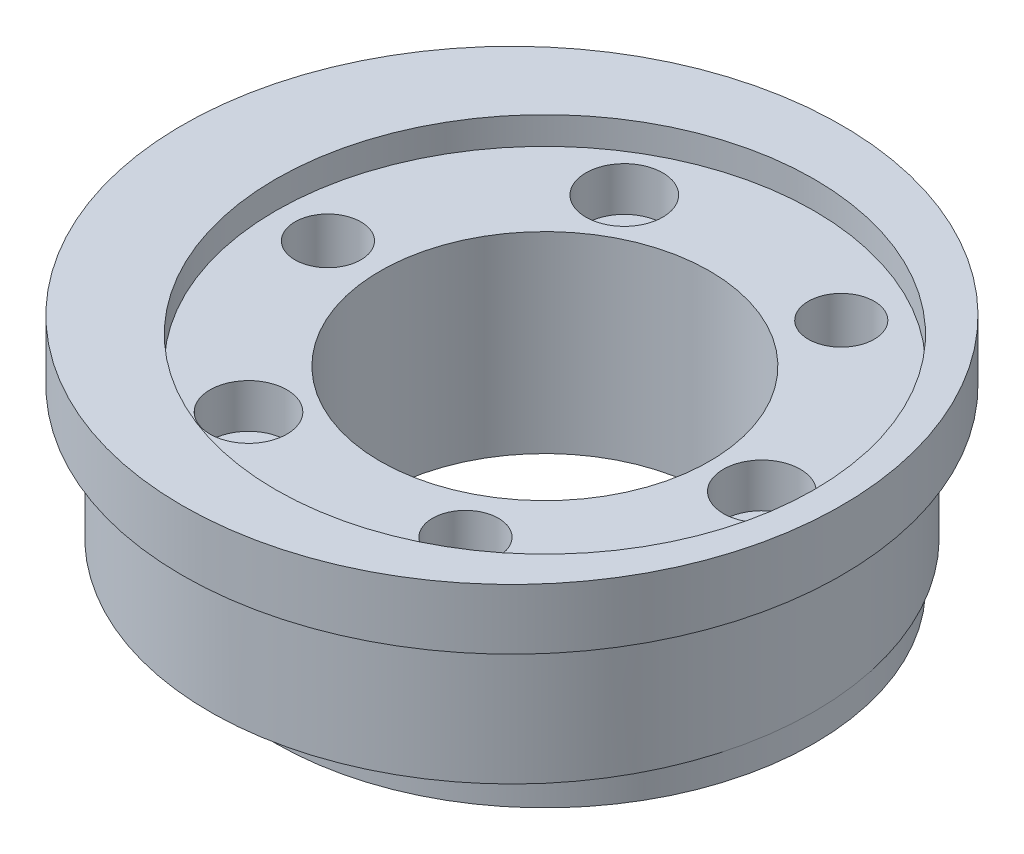
ISO-10303-21;
HEADER;
FILE_DESCRIPTION(('STEP AP214'),'2;1');
FILE_NAME('part.step','',(''),(''),'','','');
FILE_SCHEMA(('AUTOMOTIVE_DESIGN { 1 0 10303 214 1 1 1 1 }'));
ENDSEC;
DATA;
#1=APPLICATION_CONTEXT('core data for automotive mechanical design processes');
#2=APPLICATION_PROTOCOL_DEFINITION('international standard','automotive_design',2000,#1);
#3=PRODUCT_CONTEXT('',#1,'mechanical');
#4=PRODUCT('Part','Part','',(#3));
#5=PRODUCT_RELATED_PRODUCT_CATEGORY('part','',(#4));
#6=PRODUCT_DEFINITION_FORMATION('','',#4);
#7=PRODUCT_DEFINITION_CONTEXT('part definition',#1,'design');
#8=PRODUCT_DEFINITION('design','',#6,#7);
#9=PRODUCT_DEFINITION_SHAPE('','',#8);
#10=(LENGTH_UNIT() NAMED_UNIT(*) SI_UNIT(.MILLI.,.METRE.));
#11=(NAMED_UNIT(*) PLANE_ANGLE_UNIT() SI_UNIT($,.RADIAN.));
#12=(NAMED_UNIT(*) SI_UNIT($,.STERADIAN.) SOLID_ANGLE_UNIT());
#13=UNCERTAINTY_MEASURE_WITH_UNIT(LENGTH_MEASURE(1.E-05),#10,'distance_accuracy_value','');
#14=(GEOMETRIC_REPRESENTATION_CONTEXT(3) GLOBAL_UNCERTAINTY_ASSIGNED_CONTEXT((#13)) GLOBAL_UNIT_ASSIGNED_CONTEXT((#10,
#11,#12)) REPRESENTATION_CONTEXT('',''));
#15=CARTESIAN_POINT('',(0.,0.,0.));
#16=DIRECTION('',(0.,0.,1.));
#17=DIRECTION('',(1.,0.,0.));
#18=AXIS2_PLACEMENT_3D('',#15,#16,#17);
#19=CARTESIAN_POINT('',(0.,15.,0.));
#20=DIRECTION('',(0.,1.,0.));
#21=DIRECTION('',(0.,0.,1.));
#22=AXIS2_PLACEMENT_3D('',#19,#20,#21);
#23=PLANE('',#22);
#24=CARTESIAN_POINT('',(-6.87499999999996,15.,-17.1040017247427));
#25=DIRECTION('',(0.,1.,0.));
#26=DIRECTION('',(0.,0.,1.));
#27=AXIS2_PLACEMENT_3D('',#24,#25,#26);
#28=CIRCLE('',#27,3.5);
#29=CARTESIAN_POINT('',(-6.87499999999996,15.,-13.6040017247427));
#30=VERTEX_POINT('',#29);
#31=EDGE_CURVE('E138',#30,#30,#28,.T.);
#32=ORIENTED_EDGE('',*,*,#31,.F.);
#33=EDGE_LOOP('',(#32));
#34=FACE_BOUND('',#33,.T.);
#35=CARTESIAN_POINT('',(22.7500000000005,15.,-6.83481049534862E-13));
#36=DIRECTION('',(0.,1.,0.));
#37=DIRECTION('',(0.,0.,1.));
#38=AXIS2_PLACEMENT_3D('',#35,#36,#37);
#39=CIRCLE('',#38,3.5);
#40=CARTESIAN_POINT('',(22.7500000000005,15.,3.49999999999932));
#41=VERTEX_POINT('',#40);
#42=EDGE_CURVE('E128',#41,#41,#39,.T.);
#43=ORIENTED_EDGE('',*,*,#42,.F.);
#44=EDGE_LOOP('',(#43));
#45=FACE_BOUND('',#44,.T.);
#46=CARTESIAN_POINT('',(-6.87499999999923,15.,17.1040017247426));
#47=DIRECTION('',(0.,1.,0.));
#48=DIRECTION('',(0.,0.,1.));
#49=AXIS2_PLACEMENT_3D('',#46,#47,#48);
#50=CIRCLE('',#49,3.5);
#51=CARTESIAN_POINT('',(-6.87499999999923,15.,20.6040017247426));
#52=VERTEX_POINT('',#51);
#53=EDGE_CURVE('E118',#52,#52,#50,.T.);
#54=ORIENTED_EDGE('',*,*,#53,.F.);
#55=EDGE_LOOP('',(#54));
#56=FACE_BOUND('',#55,.T.);
#57=CARTESIAN_POINT('',(3.,15.,0.));
#58=DIRECTION('',(0.,1.,0.));
#59=DIRECTION('',(0.,0.,1.));
#60=AXIS2_PLACEMENT_3D('',#57,#58,#59);
#61=CIRCLE('',#60,15.);
#62=CARTESIAN_POINT('',(3.,15.,15.));
#63=VERTEX_POINT('',#62);
#64=EDGE_CURVE('E77',#63,#63,#61,.T.);
#65=ORIENTED_EDGE('',*,*,#64,.F.);
#66=EDGE_LOOP('',(#65));
#67=FACE_BOUND('',#66,.T.);
#68=CARTESIAN_POINT('',(-16.75,15.,0.));
#69=DIRECTION('',(0.,1.,0.));
#70=DIRECTION('',(0.,0.,1.));
#71=AXIS2_PLACEMENT_3D('',#68,#69,#70);
#72=CIRCLE('',#71,3.);
#73=CARTESIAN_POINT('',(-16.75,15.,3.));
#74=VERTEX_POINT('',#73);
#75=EDGE_CURVE('E88',#74,#74,#72,.T.);
#76=ORIENTED_EDGE('',*,*,#75,.F.);
#77=EDGE_LOOP('',(#76));
#78=FACE_BOUND('',#77,.T.);
#79=CARTESIAN_POINT('',(12.8750000000001,15.,-17.1040017247429));
#80=DIRECTION('',(0.,1.,0.));
#81=DIRECTION('',(0.,0.,1.));
#82=AXIS2_PLACEMENT_3D('',#79,#80,#81);
#83=CIRCLE('',#82,3.);
#84=CARTESIAN_POINT('',(12.8750000000001,15.,-14.1040017247429));
#85=VERTEX_POINT('',#84);
#86=EDGE_CURVE('E80',#85,#85,#83,.T.);
#87=ORIENTED_EDGE('',*,*,#86,.F.);
#88=EDGE_LOOP('',(#87));
#89=FACE_BOUND('',#88,.T.);
#90=CARTESIAN_POINT('',(12.8749999999998,15.,17.1040017247425));
#91=DIRECTION('',(0.,1.,0.));
#92=DIRECTION('',(0.,0.,1.));
#93=AXIS2_PLACEMENT_3D('',#90,#91,#92);
#94=CIRCLE('',#93,3.);
#95=CARTESIAN_POINT('',(12.8749999999998,15.,20.1040017247425));
#96=VERTEX_POINT('',#95);
#97=EDGE_CURVE('E73',#96,#96,#94,.T.);
#98=ORIENTED_EDGE('',*,*,#97,.F.);
#99=EDGE_LOOP('',(#98));
#100=FACE_BOUND('',#99,.T.);
#101=CARTESIAN_POINT('',(3.,15.,0.));
#102=DIRECTION('',(0.,1.,0.));
#103=DIRECTION('',(0.,0.,1.));
#104=AXIS2_PLACEMENT_3D('',#101,#102,#103);
#105=CIRCLE('',#104,24.5);
#106=CARTESIAN_POINT('',(3.,15.,24.5));
#107=VERTEX_POINT('',#106);
#108=EDGE_CURVE('E66',#107,#107,#105,.T.);
#109=ORIENTED_EDGE('',*,*,#108,.T.);
#110=EDGE_LOOP('',(#109));
#111=FACE_BOUND('',#110,.T.);
#112=ADVANCED_FACE('F43',(#34,#45,#56,#67,#78,#89,#100,#111),#23,.T.);
#113=CARTESIAN_POINT('',(0.,15.,0.));
#114=DIRECTION('',(0.,-1.,0.));
#115=DIRECTION('',(0.,0.,-1.));
#116=AXIS2_PLACEMENT_3D('',#113,#114,#115);
#117=CYLINDRICAL_SURFACE('',#116,27.5);
#118=CARTESIAN_POINT('',(0.,0.,0.));
#119=DIRECTION('',(0.,1.,0.));
#120=DIRECTION('',(0.,0.,1.));
#121=AXIS2_PLACEMENT_3D('',#118,#119,#120);
#122=CIRCLE('',#121,27.5);
#123=CARTESIAN_POINT('',(27.5,0.,0.));
#124=VERTEX_POINT('',#123);
#125=EDGE_CURVE('E51',#124,#124,#122,.T.);
#126=ORIENTED_EDGE('',*,*,#125,.T.);
#127=EDGE_LOOP('',(#126));
#128=FACE_BOUND('',#127,.T.);
#129=CARTESIAN_POINT('',(0.,12.,0.));
#130=DIRECTION('',(0.,1.,0.));
#131=DIRECTION('',(0.,0.,1.));
#132=AXIS2_PLACEMENT_3D('',#129,#130,#131);
#133=CIRCLE('',#132,27.5);
#134=CARTESIAN_POINT('',(0.,12.,27.5));
#135=VERTEX_POINT('',#134);
#136=EDGE_CURVE('E11',#135,#135,#133,.T.);
#137=ORIENTED_EDGE('',*,*,#136,.F.);
#138=EDGE_LOOP('',(#137));
#139=FACE_BOUND('',#138,.T.);
#140=ADVANCED_FACE('F45',(#128,#139),#117,.T.);
#141=CARTESIAN_POINT('',(22.75,-2.5,1.39413705213259E-13));
#142=DIRECTION('',(0.,1.,0.));
#143=DIRECTION('',(0.,0.,1.));
#144=AXIS2_PLACEMENT_3D('',#141,#142,#143);
#145=CYLINDRICAL_SURFACE('',#144,2.);
#146=CARTESIAN_POINT('',(22.75,-2.5,1.39413705213259E-13));
#147=DIRECTION('',(0.,1.,0.));
#148=DIRECTION('',(0.,0.,1.));
#149=AXIS2_PLACEMENT_3D('',#146,#147,#148);
#150=CIRCLE('',#149,2.);
#151=CARTESIAN_POINT('',(22.75,-2.5,2.00000000000014));
#152=VERTEX_POINT('',#151);
#153=EDGE_CURVE('E108',#152,#152,#150,.T.);
#154=ORIENTED_EDGE('',*,*,#153,.F.);
#155=EDGE_LOOP('',(#154));
#156=FACE_BOUND('',#155,.T.);
#157=CARTESIAN_POINT('',(22.75,11.,1.39413705213259E-13));
#158=DIRECTION('',(0.,1.,0.));
#159=DIRECTION('',(0.,0.,1.));
#160=AXIS2_PLACEMENT_3D('',#157,#158,#159);
#161=CIRCLE('',#160,2.);
#162=CARTESIAN_POINT('',(22.75,11.,2.00000000000014));
#163=VERTEX_POINT('',#162);
#164=EDGE_CURVE('E134',#163,#163,#161,.F.);
#165=ORIENTED_EDGE('',*,*,#164,.F.);
#166=EDGE_LOOP('',(#165));
#167=FACE_BOUND('',#166,.T.);
#168=ADVANCED_FACE('F198',(#156,#167),#145,.F.);
#169=CARTESIAN_POINT('',(-6.8750000000002,-2.5,17.1040017247425));
#170=DIRECTION('',(0.,1.,0.));
#171=DIRECTION('',(0.,0.,1.));
#172=AXIS2_PLACEMENT_3D('',#169,#170,#171);
#173=CYLINDRICAL_SURFACE('',#172,2.);
#174=CARTESIAN_POINT('',(-6.8750000000002,-2.5,17.1040017247425));
#175=DIRECTION('',(0.,1.,0.));
#176=DIRECTION('',(0.,0.,1.));
#177=AXIS2_PLACEMENT_3D('',#174,#175,#176);
#178=CIRCLE('',#177,2.);
#179=CARTESIAN_POINT('',(-6.8750000000002,-2.5,19.1040017247425));
#180=VERTEX_POINT('',#179);
#181=EDGE_CURVE('E111',#180,#180,#178,.T.);
#182=ORIENTED_EDGE('',*,*,#181,.F.);
#183=EDGE_LOOP('',(#182));
#184=FACE_BOUND('',#183,.T.);
#185=CARTESIAN_POINT('',(-6.8750000000002,11.,17.1040017247425));
#186=DIRECTION('',(0.,1.,0.));
#187=DIRECTION('',(0.,0.,1.));
#188=AXIS2_PLACEMENT_3D('',#185,#186,#187);
#189=CIRCLE('',#188,2.);
#190=CARTESIAN_POINT('',(-6.8750000000002,11.,19.1040017247425));
#191=VERTEX_POINT('',#190);
#192=EDGE_CURVE('E122',#191,#191,#189,.F.);
#193=ORIENTED_EDGE('',*,*,#192,.F.);
#194=EDGE_LOOP('',(#193));
#195=FACE_BOUND('',#194,.T.);
#196=ADVANCED_FACE('F212',(#184,#195),#173,.F.);
#197=CARTESIAN_POINT('',(-6.87499999999996,-2.5,-17.1040017247427));
#198=DIRECTION('',(0.,1.,0.));
#199=DIRECTION('',(0.,0.,1.));
#200=AXIS2_PLACEMENT_3D('',#197,#198,#199);
#201=CYLINDRICAL_SURFACE('',#200,2.);
#202=CARTESIAN_POINT('',(-6.87499999999996,-2.5,-17.1040017247427));
#203=DIRECTION('',(0.,1.,0.));
#204=DIRECTION('',(0.,0.,1.));
#205=AXIS2_PLACEMENT_3D('',#202,#203,#204);
#206=CIRCLE('',#205,2.);
#207=CARTESIAN_POINT('',(-6.87499999999996,-2.5,-15.1040017247427));
#208=VERTEX_POINT('',#207);
#209=EDGE_CURVE('E102',#208,#208,#206,.T.);
#210=ORIENTED_EDGE('',*,*,#209,.F.);
#211=EDGE_LOOP('',(#210));
#212=FACE_BOUND('',#211,.T.);
#213=CARTESIAN_POINT('',(-6.87499999999996,11.,-17.1040017247427));
#214=DIRECTION('',(0.,1.,0.));
#215=DIRECTION('',(0.,0.,1.));
#216=AXIS2_PLACEMENT_3D('',#213,#214,#215);
#217=CIRCLE('',#216,2.);
#218=CARTESIAN_POINT('',(-6.87499999999996,11.,-15.1040017247427));
#219=VERTEX_POINT('',#218);
#220=EDGE_CURVE('E144',#219,#219,#217,.F.);
#221=ORIENTED_EDGE('',*,*,#220,.F.);
#222=EDGE_LOOP('',(#221));
#223=FACE_BOUND('',#222,.T.);
#224=ADVANCED_FACE('F205',(#212,#223),#201,.F.);
#225=CARTESIAN_POINT('',(0.,0.,0.));
#226=DIRECTION('',(0.,1.,0.));
#227=DIRECTION('',(0.,0.,1.));
#228=AXIS2_PLACEMENT_3D('',#225,#226,#227);
#229=PLANE('',#228);
#230=ORIENTED_EDGE('',*,*,#125,.F.);
#231=CARTESIAN_POINT('',(3.,0.,0.));
#232=DIRECTION('',(0.,-1.,0.));
#233=DIRECTION('',(0.,0.,-1.));
#234=AXIS2_PLACEMENT_3D('',#231,#232,#233);
#235=CIRCLE('',#234,24.5);
#236=EDGE_CURVE('E58',#124,#124,#235,.T.);
#237=ORIENTED_EDGE('',*,*,#236,.F.);
#238=EDGE_LOOP('',(#230,#237));
#239=FACE_BOUND('',#238,.T.);
#240=ADVANCED_FACE('F56',(#239),#229,.F.);
#241=CARTESIAN_POINT('',(3.,17.5,0.));
#242=DIRECTION('',(0.,-1.,0.));
#243=DIRECTION('',(0.,0.,-1.));
#244=AXIS2_PLACEMENT_3D('',#241,#242,#243);
#245=CYLINDRICAL_SURFACE('',#244,24.5);
#246=CARTESIAN_POINT('',(3.,17.5,0.));
#247=DIRECTION('',(0.,1.,0.));
#248=DIRECTION('',(0.,0.,1.));
#249=AXIS2_PLACEMENT_3D('',#246,#247,#248);
#250=CIRCLE('',#249,24.5);
#251=CARTESIAN_POINT('',(3.,17.5,24.5));
#252=VERTEX_POINT('',#251);
#253=EDGE_CURVE('E61',#252,#252,#250,.T.);
#254=ORIENTED_EDGE('',*,*,#253,.T.);
#255=EDGE_LOOP('',(#254));
#256=FACE_BOUND('',#255,.T.);
#257=ORIENTED_EDGE('',*,*,#108,.F.);
#258=EDGE_LOOP('',(#257));
#259=FACE_BOUND('',#258,.T.);
#260=ADVANCED_FACE('F202',(#256,#259),#245,.F.);
#261=CARTESIAN_POINT('',(0.,17.5,0.));
#262=DIRECTION('',(0.,1.,0.));
#263=DIRECTION('',(0.,0.,1.));
#264=AXIS2_PLACEMENT_3D('',#261,#262,#263);
#265=PLANE('',#264);
#266=ORIENTED_EDGE('',*,*,#253,.F.);
#267=EDGE_LOOP('',(#266));
#268=FACE_BOUND('',#267,.T.);
#269=CARTESIAN_POINT('',(0.,17.5,0.));
#270=DIRECTION('',(0.,1.,0.));
#271=DIRECTION('',(0.,0.,1.));
#272=AXIS2_PLACEMENT_3D('',#269,#270,#271);
#273=CIRCLE('',#272,30.);
#274=CARTESIAN_POINT('',(0.,17.5,30.));
#275=VERTEX_POINT('',#274);
#276=EDGE_CURVE('E172',#275,#275,#273,.T.);
#277=ORIENTED_EDGE('',*,*,#276,.T.);
#278=EDGE_LOOP('',(#277));
#279=FACE_BOUND('',#278,.T.);
#280=ADVANCED_FACE('F210',(#268,#279),#265,.T.);
#281=CARTESIAN_POINT('',(12.8749999999998,10.,17.1040017247425));
#282=DIRECTION('',(0.,1.,0.));
#283=DIRECTION('',(0.,0.,1.));
#284=AXIS2_PLACEMENT_3D('',#281,#282,#283);
#285=CYLINDRICAL_SURFACE('',#284,3.);
#286=CARTESIAN_POINT('',(12.8749999999998,10.,17.1040017247425));
#287=DIRECTION('',(0.,1.,0.));
#288=DIRECTION('',(0.,0.,1.));
#289=AXIS2_PLACEMENT_3D('',#286,#287,#288);
#290=CIRCLE('',#289,3.);
#291=CARTESIAN_POINT('',(12.8749999999998,10.,20.1040017247425));
#292=VERTEX_POINT('',#291);
#293=EDGE_CURVE('E76',#292,#292,#290,.T.);
#294=ORIENTED_EDGE('',*,*,#293,.F.);
#295=EDGE_LOOP('',(#294));
#296=FACE_BOUND('',#295,.T.);
#297=ORIENTED_EDGE('',*,*,#97,.T.);
#298=EDGE_LOOP('',(#297));
#299=FACE_BOUND('',#298,.T.);
#300=ADVANCED_FACE('F261',(#296,#299),#285,.F.);
#301=CARTESIAN_POINT('',(0.,10.,0.));
#302=DIRECTION('',(0.,1.,0.));
#303=DIRECTION('',(0.,0.,1.));
#304=AXIS2_PLACEMENT_3D('',#301,#302,#303);
#305=PLANE('',#304);
#306=CARTESIAN_POINT('',(12.8750000000001,10.,17.1040017247423));
#307=DIRECTION('',(0.,1.,0.));
#308=DIRECTION('',(0.,0.,1.));
#309=AXIS2_PLACEMENT_3D('',#306,#307,#308);
#310=CIRCLE('',#309,2.);
#311=CARTESIAN_POINT('',(12.8750000000001,10.,19.1040017247423));
#312=VERTEX_POINT('',#311);
#313=EDGE_CURVE('E150',#312,#312,#310,.T.);
#314=ORIENTED_EDGE('',*,*,#313,.F.);
#315=EDGE_LOOP('',(#314));
#316=FACE_BOUND('',#315,.T.);
#317=ORIENTED_EDGE('',*,*,#293,.T.);
#318=EDGE_LOOP('',(#317));
#319=FACE_BOUND('',#318,.T.);
#320=ADVANCED_FACE('F257',(#316,#319),#305,.T.);
#321=CARTESIAN_POINT('',(12.8750000000001,10.,-17.1040017247429));
#322=DIRECTION('',(0.,1.,0.));
#323=DIRECTION('',(0.,0.,1.));
#324=AXIS2_PLACEMENT_3D('',#321,#322,#323);
#325=CYLINDRICAL_SURFACE('',#324,3.);
#326=CARTESIAN_POINT('',(12.8750000000001,10.,-17.1040017247429));
#327=DIRECTION('',(0.,1.,0.));
#328=DIRECTION('',(0.,0.,1.));
#329=AXIS2_PLACEMENT_3D('',#326,#327,#328);
#330=CIRCLE('',#329,3.);
#331=CARTESIAN_POINT('',(12.8750000000001,10.,-14.1040017247429));
#332=VERTEX_POINT('',#331);
#333=EDGE_CURVE('E84',#332,#332,#330,.T.);
#334=ORIENTED_EDGE('',*,*,#333,.F.);
#335=EDGE_LOOP('',(#334));
#336=FACE_BOUND('',#335,.T.);
#337=ORIENTED_EDGE('',*,*,#86,.T.);
#338=EDGE_LOOP('',(#337));
#339=FACE_BOUND('',#338,.T.);
#340=ADVANCED_FACE('F253',(#336,#339),#325,.F.);
#341=CARTESIAN_POINT('',(0.,10.,0.));
#342=DIRECTION('',(0.,1.,0.));
#343=DIRECTION('',(0.,0.,1.));
#344=AXIS2_PLACEMENT_3D('',#341,#342,#343);
#345=PLANE('',#344);
#346=CARTESIAN_POINT('',(12.8749999999998,10.,-17.104001724743));
#347=DIRECTION('',(0.,1.,0.));
#348=DIRECTION('',(0.,0.,1.));
#349=AXIS2_PLACEMENT_3D('',#346,#347,#348);
#350=CIRCLE('',#349,2.);
#351=CARTESIAN_POINT('',(12.8749999999998,10.,-15.104001724743));
#352=VERTEX_POINT('',#351);
#353=EDGE_CURVE('E157',#352,#352,#350,.T.);
#354=ORIENTED_EDGE('',*,*,#353,.F.);
#355=EDGE_LOOP('',(#354));
#356=FACE_BOUND('',#355,.T.);
#357=ORIENTED_EDGE('',*,*,#333,.T.);
#358=EDGE_LOOP('',(#357));
#359=FACE_BOUND('',#358,.T.);
#360=ADVANCED_FACE('F249',(#356,#359),#345,.T.);
#361=CARTESIAN_POINT('',(-16.75,10.,0.));
#362=DIRECTION('',(0.,1.,0.));
#363=DIRECTION('',(0.,0.,1.));
#364=AXIS2_PLACEMENT_3D('',#361,#362,#363);
#365=CYLINDRICAL_SURFACE('',#364,3.);
#366=CARTESIAN_POINT('',(-16.75,10.,0.));
#367=DIRECTION('',(0.,1.,0.));
#368=DIRECTION('',(0.,0.,1.));
#369=AXIS2_PLACEMENT_3D('',#366,#367,#368);
#370=CIRCLE('',#369,3.);
#371=CARTESIAN_POINT('',(-16.75,10.,3.));
#372=VERTEX_POINT('',#371);
#373=EDGE_CURVE('E71',#372,#372,#370,.T.);
#374=ORIENTED_EDGE('',*,*,#373,.F.);
#375=EDGE_LOOP('',(#374));
#376=FACE_BOUND('',#375,.T.);
#377=ORIENTED_EDGE('',*,*,#75,.T.);
#378=EDGE_LOOP('',(#377));
#379=FACE_BOUND('',#378,.T.);
#380=ADVANCED_FACE('F245',(#376,#379),#365,.F.);
#381=CARTESIAN_POINT('',(0.,10.,0.));
#382=DIRECTION('',(0.,1.,0.));
#383=DIRECTION('',(0.,0.,1.));
#384=AXIS2_PLACEMENT_3D('',#381,#382,#383);
#385=PLANE('',#384);
#386=CARTESIAN_POINT('',(-16.75,10.,0.));
#387=DIRECTION('',(0.,1.,0.));
#388=DIRECTION('',(0.,0.,1.));
#389=AXIS2_PLACEMENT_3D('',#386,#387,#388);
#390=CIRCLE('',#389,2.);
#391=CARTESIAN_POINT('',(-16.75,10.,2.));
#392=VERTEX_POINT('',#391);
#393=EDGE_CURVE('E165',#392,#392,#390,.T.);
#394=ORIENTED_EDGE('',*,*,#393,.F.);
#395=EDGE_LOOP('',(#394));
#396=FACE_BOUND('',#395,.T.);
#397=ORIENTED_EDGE('',*,*,#373,.T.);
#398=EDGE_LOOP('',(#397));
#399=FACE_BOUND('',#398,.T.);
#400=ADVANCED_FACE('F241',(#396,#399),#385,.T.);
#401=CARTESIAN_POINT('',(3.,0.,0.));
#402=DIRECTION('',(0.,1.,0.));
#403=DIRECTION('',(0.,0.,1.));
#404=AXIS2_PLACEMENT_3D('',#401,#402,#403);
#405=CYLINDRICAL_SURFACE('',#404,15.);
#406=ORIENTED_EDGE('',*,*,#64,.T.);
#407=EDGE_LOOP('',(#406));
#408=FACE_BOUND('',#407,.T.);
#409=CARTESIAN_POINT('',(3.,-2.5,0.));
#410=DIRECTION('',(0.,-1.,0.));
#411=DIRECTION('',(0.,0.,-1.));
#412=AXIS2_PLACEMENT_3D('',#409,#410,#411);
#413=CIRCLE('',#412,15.);
#414=CARTESIAN_POINT('',(3.,-2.5,-15.));
#415=VERTEX_POINT('',#414);
#416=EDGE_CURVE('E98',#415,#415,#413,.F.);
#417=ORIENTED_EDGE('',*,*,#416,.F.);
#418=EDGE_LOOP('',(#417));
#419=FACE_BOUND('',#418,.T.);
#420=ADVANCED_FACE('F237',(#408,#419),#405,.F.);
#421=CARTESIAN_POINT('',(3.,-2.5,0.));
#422=DIRECTION('',(0.,1.,0.));
#423=DIRECTION('',(0.,0.,1.));
#424=AXIS2_PLACEMENT_3D('',#421,#422,#423);
#425=CYLINDRICAL_SURFACE('',#424,24.5);
#426=CARTESIAN_POINT('',(3.,-2.5,0.));
#427=DIRECTION('',(0.,-1.,0.));
#428=DIRECTION('',(0.,0.,-1.));
#429=AXIS2_PLACEMENT_3D('',#426,#427,#428);
#430=CIRCLE('',#429,24.5);
#431=CARTESIAN_POINT('',(3.,-2.5,-24.5));
#432=VERTEX_POINT('',#431);
#433=EDGE_CURVE('E101',#432,#432,#430,.T.);
#434=ORIENTED_EDGE('',*,*,#433,.F.);
#435=EDGE_LOOP('',(#434));
#436=FACE_BOUND('',#435,.T.);
#437=ORIENTED_EDGE('',*,*,#236,.T.);
#438=EDGE_LOOP('',(#437));
#439=FACE_BOUND('',#438,.T.);
#440=ADVANCED_FACE('F233',(#436,#439),#425,.T.);
#441=CARTESIAN_POINT('',(0.,-2.5,0.));
#442=DIRECTION('',(0.,-1.,0.));
#443=DIRECTION('',(0.,0.,-1.));
#444=AXIS2_PLACEMENT_3D('',#441,#442,#443);
#445=PLANE('',#444);
#446=ORIENTED_EDGE('',*,*,#209,.T.);
#447=EDGE_LOOP('',(#446));
#448=FACE_BOUND('',#447,.T.);
#449=ORIENTED_EDGE('',*,*,#181,.T.);
#450=EDGE_LOOP('',(#449));
#451=FACE_BOUND('',#450,.T.);
#452=ORIENTED_EDGE('',*,*,#153,.T.);
#453=EDGE_LOOP('',(#452));
#454=FACE_BOUND('',#453,.T.);
#455=ORIENTED_EDGE('',*,*,#433,.T.);
#456=EDGE_LOOP('',(#455));
#457=FACE_BOUND('',#456,.T.);
#458=ORIENTED_EDGE('',*,*,#416,.T.);
#459=EDGE_LOOP('',(#458));
#460=FACE_BOUND('',#459,.T.);
#461=ADVANCED_FACE('F229',(#448,#451,#454,#457,#460),#445,.T.);
#462=CARTESIAN_POINT('',(-6.87499999999996,11.,-17.1040017247427));
#463=DIRECTION('',(0.,1.,0.));
#464=DIRECTION('',(0.,0.,1.));
#465=AXIS2_PLACEMENT_3D('',#462,#463,#464);
#466=CYLINDRICAL_SURFACE('',#465,3.5);
#467=CARTESIAN_POINT('',(-6.87499999999996,11.,-17.1040017247427));
#468=DIRECTION('',(0.,1.,0.));
#469=DIRECTION('',(0.,0.,1.));
#470=AXIS2_PLACEMENT_3D('',#467,#468,#469);
#471=CIRCLE('',#470,3.5);
#472=CARTESIAN_POINT('',(-6.87499999999996,11.,-13.6040017247427));
#473=VERTEX_POINT('',#472);
#474=EDGE_CURVE('E112',#473,#473,#471,.T.);
#475=ORIENTED_EDGE('',*,*,#474,.F.);
#476=EDGE_LOOP('',(#475));
#477=FACE_BOUND('',#476,.T.);
#478=ORIENTED_EDGE('',*,*,#31,.T.);
#479=EDGE_LOOP('',(#478));
#480=FACE_BOUND('',#479,.T.);
#481=ADVANCED_FACE('F232',(#477,#480),#466,.F.);
#482=CARTESIAN_POINT('',(0.,11.,0.));
#483=DIRECTION('',(0.,1.,0.));
#484=DIRECTION('',(0.,0.,1.));
#485=AXIS2_PLACEMENT_3D('',#482,#483,#484);
#486=PLANE('',#485);
#487=ORIENTED_EDGE('',*,*,#220,.T.);
#488=EDGE_LOOP('',(#487));
#489=FACE_BOUND('',#488,.T.);
#490=ORIENTED_EDGE('',*,*,#474,.T.);
#491=EDGE_LOOP('',(#490));
#492=FACE_BOUND('',#491,.T.);
#493=ADVANCED_FACE('F319',(#489,#492),#486,.T.);
#494=CARTESIAN_POINT('',(-6.87499999999923,11.,17.1040017247426));
#495=DIRECTION('',(0.,1.,0.));
#496=DIRECTION('',(0.,0.,1.));
#497=AXIS2_PLACEMENT_3D('',#494,#495,#496);
#498=CYLINDRICAL_SURFACE('',#497,3.5);
#499=CARTESIAN_POINT('',(-6.87499999999923,11.,17.1040017247426));
#500=DIRECTION('',(0.,1.,0.));
#501=DIRECTION('',(0.,0.,1.));
#502=AXIS2_PLACEMENT_3D('',#499,#500,#501);
#503=CIRCLE('',#502,3.5);
#504=CARTESIAN_POINT('',(-6.87499999999923,11.,20.6040017247426));
#505=VERTEX_POINT('',#504);
#506=EDGE_CURVE('E124',#505,#505,#503,.T.);
#507=ORIENTED_EDGE('',*,*,#506,.F.);
#508=EDGE_LOOP('',(#507));
#509=FACE_BOUND('',#508,.T.);
#510=ORIENTED_EDGE('',*,*,#53,.T.);
#511=EDGE_LOOP('',(#510));
#512=FACE_BOUND('',#511,.T.);
#513=ADVANCED_FACE('F223',(#509,#512),#498,.F.);
#514=CARTESIAN_POINT('',(0.,11.,0.));
#515=DIRECTION('',(0.,1.,0.));
#516=DIRECTION('',(0.,0.,1.));
#517=AXIS2_PLACEMENT_3D('',#514,#515,#516);
#518=PLANE('',#517);
#519=ORIENTED_EDGE('',*,*,#192,.T.);
#520=EDGE_LOOP('',(#519));
#521=FACE_BOUND('',#520,.T.);
#522=ORIENTED_EDGE('',*,*,#506,.T.);
#523=EDGE_LOOP('',(#522));
#524=FACE_BOUND('',#523,.T.);
#525=ADVANCED_FACE('F333',(#521,#524),#518,.T.);
#526=CARTESIAN_POINT('',(22.7500000000005,11.,-6.83481049534862E-13));
#527=DIRECTION('',(0.,1.,0.));
#528=DIRECTION('',(0.,0.,1.));
#529=AXIS2_PLACEMENT_3D('',#526,#527,#528);
#530=CYLINDRICAL_SURFACE('',#529,3.5);
#531=CARTESIAN_POINT('',(22.7500000000005,11.,-6.83481049534862E-13));
#532=DIRECTION('',(0.,1.,0.));
#533=DIRECTION('',(0.,0.,1.));
#534=AXIS2_PLACEMENT_3D('',#531,#532,#533);
#535=CIRCLE('',#534,3.5);
#536=CARTESIAN_POINT('',(22.7500000000005,11.,3.49999999999932));
#537=VERTEX_POINT('',#536);
#538=EDGE_CURVE('E135',#537,#537,#535,.T.);
#539=ORIENTED_EDGE('',*,*,#538,.F.);
#540=EDGE_LOOP('',(#539));
#541=FACE_BOUND('',#540,.T.);
#542=ORIENTED_EDGE('',*,*,#42,.T.);
#543=EDGE_LOOP('',(#542));
#544=FACE_BOUND('',#543,.T.);
#545=ADVANCED_FACE('F337',(#541,#544),#530,.F.);
#546=CARTESIAN_POINT('',(0.,11.,0.));
#547=DIRECTION('',(0.,1.,0.));
#548=DIRECTION('',(0.,0.,1.));
#549=AXIS2_PLACEMENT_3D('',#546,#547,#548);
#550=PLANE('',#549);
#551=ORIENTED_EDGE('',*,*,#164,.T.);
#552=EDGE_LOOP('',(#551));
#553=FACE_BOUND('',#552,.T.);
#554=ORIENTED_EDGE('',*,*,#538,.T.);
#555=EDGE_LOOP('',(#554));
#556=FACE_BOUND('',#555,.T.);
#557=ADVANCED_FACE('F343',(#553,#556),#550,.T.);
#558=CARTESIAN_POINT('',(-16.75,7.5,0.));
#559=DIRECTION('',(0.,1.,0.));
#560=DIRECTION('',(0.,0.,1.));
#561=AXIS2_PLACEMENT_3D('',#558,#559,#560);
#562=CYLINDRICAL_SURFACE('',#561,2.);
#563=CARTESIAN_POINT('',(-16.75,7.5,0.));
#564=DIRECTION('',(0.,1.,0.));
#565=DIRECTION('',(0.,0.,1.));
#566=AXIS2_PLACEMENT_3D('',#563,#564,#565);
#567=CIRCLE('',#566,2.);
#568=CARTESIAN_POINT('',(-16.75,7.5,2.));
#569=VERTEX_POINT('',#568);
#570=EDGE_CURVE('E123',#569,#569,#567,.T.);
#571=ORIENTED_EDGE('',*,*,#570,.F.);
#572=EDGE_LOOP('',(#571));
#573=FACE_BOUND('',#572,.T.);
#574=ORIENTED_EDGE('',*,*,#393,.T.);
#575=EDGE_LOOP('',(#574));
#576=FACE_BOUND('',#575,.T.);
#577=ADVANCED_FACE('F350',(#573,#576),#562,.F.);
#578=CARTESIAN_POINT('',(0.,7.5,0.));
#579=DIRECTION('',(0.,1.,0.));
#580=DIRECTION('',(0.,0.,1.));
#581=AXIS2_PLACEMENT_3D('',#578,#579,#580);
#582=PLANE('',#581);
#583=ORIENTED_EDGE('',*,*,#570,.T.);
#584=EDGE_LOOP('',(#583));
#585=FACE_BOUND('',#584,.T.);
#586=ADVANCED_FACE('F358',(#585),#582,.T.);
#587=CARTESIAN_POINT('',(12.8749999999998,7.5,-17.104001724743));
#588=DIRECTION('',(0.,1.,0.));
#589=DIRECTION('',(0.,0.,1.));
#590=AXIS2_PLACEMENT_3D('',#587,#588,#589);
#591=CYLINDRICAL_SURFACE('',#590,2.);
#592=CARTESIAN_POINT('',(12.8749999999998,7.5,-17.104001724743));
#593=DIRECTION('',(0.,1.,0.));
#594=DIRECTION('',(0.,0.,1.));
#595=AXIS2_PLACEMENT_3D('',#592,#593,#594);
#596=CIRCLE('',#595,2.);
#597=CARTESIAN_POINT('',(12.8749999999998,7.5,-15.104001724743));
#598=VERTEX_POINT('',#597);
#599=EDGE_CURVE('E161',#598,#598,#596,.T.);
#600=ORIENTED_EDGE('',*,*,#599,.F.);
#601=EDGE_LOOP('',(#600));
#602=FACE_BOUND('',#601,.T.);
#603=ORIENTED_EDGE('',*,*,#353,.T.);
#604=EDGE_LOOP('',(#603));
#605=FACE_BOUND('',#604,.T.);
#606=ADVANCED_FACE('F364',(#602,#605),#591,.F.);
#607=CARTESIAN_POINT('',(0.,7.5,0.));
#608=DIRECTION('',(0.,1.,0.));
#609=DIRECTION('',(0.,0.,1.));
#610=AXIS2_PLACEMENT_3D('',#607,#608,#609);
#611=PLANE('',#610);
#612=ORIENTED_EDGE('',*,*,#599,.T.);
#613=EDGE_LOOP('',(#612));
#614=FACE_BOUND('',#613,.T.);
#615=ADVANCED_FACE('F371',(#614),#611,.T.);
#616=CARTESIAN_POINT('',(12.8750000000001,7.5,17.1040017247423));
#617=DIRECTION('',(0.,1.,0.));
#618=DIRECTION('',(0.,0.,1.));
#619=AXIS2_PLACEMENT_3D('',#616,#617,#618);
#620=CYLINDRICAL_SURFACE('',#619,2.);
#621=CARTESIAN_POINT('',(12.8750000000001,7.5,17.1040017247423));
#622=DIRECTION('',(0.,1.,0.));
#623=DIRECTION('',(0.,0.,1.));
#624=AXIS2_PLACEMENT_3D('',#621,#622,#623);
#625=CIRCLE('',#624,2.);
#626=CARTESIAN_POINT('',(12.8750000000001,7.5,19.1040017247423));
#627=VERTEX_POINT('',#626);
#628=EDGE_CURVE('E153',#627,#627,#625,.T.);
#629=ORIENTED_EDGE('',*,*,#628,.F.);
#630=EDGE_LOOP('',(#629));
#631=FACE_BOUND('',#630,.T.);
#632=ORIENTED_EDGE('',*,*,#313,.T.);
#633=EDGE_LOOP('',(#632));
#634=FACE_BOUND('',#633,.T.);
#635=ADVANCED_FACE('F379',(#631,#634),#620,.F.);
#636=CARTESIAN_POINT('',(0.,7.5,0.));
#637=DIRECTION('',(0.,1.,0.));
#638=DIRECTION('',(0.,0.,1.));
#639=AXIS2_PLACEMENT_3D('',#636,#637,#638);
#640=PLANE('',#639);
#641=ORIENTED_EDGE('',*,*,#628,.T.);
#642=EDGE_LOOP('',(#641));
#643=FACE_BOUND('',#642,.T.);
#644=ADVANCED_FACE('F190',(#643),#640,.T.);
#645=CARTESIAN_POINT('',(0.,12.,0.));
#646=DIRECTION('',(0.,1.,0.));
#647=DIRECTION('',(0.,0.,1.));
#648=AXIS2_PLACEMENT_3D('',#645,#646,#647);
#649=CYLINDRICAL_SURFACE('',#648,30.);
#650=CARTESIAN_POINT('',(0.,12.,0.));
#651=DIRECTION('',(0.,1.,0.));
#652=DIRECTION('',(0.,0.,1.));
#653=AXIS2_PLACEMENT_3D('',#650,#651,#652);
#654=CIRCLE('',#653,30.);
#655=CARTESIAN_POINT('',(0.,12.,30.));
#656=VERTEX_POINT('',#655);
#657=EDGE_CURVE('E154',#656,#656,#654,.T.);
#658=ORIENTED_EDGE('',*,*,#657,.T.);
#659=EDGE_LOOP('',(#658));
#660=FACE_BOUND('',#659,.T.);
#661=ORIENTED_EDGE('',*,*,#276,.F.);
#662=EDGE_LOOP('',(#661));
#663=FACE_BOUND('',#662,.T.);
#664=ADVANCED_FACE('F180',(#660,#663),#649,.T.);
#665=CARTESIAN_POINT('',(0.,12.,0.));
#666=DIRECTION('',(0.,1.,0.));
#667=DIRECTION('',(0.,0.,1.));
#668=AXIS2_PLACEMENT_3D('',#665,#666,#667);
#669=PLANE('',#668);
#670=ORIENTED_EDGE('',*,*,#136,.T.);
#671=EDGE_LOOP('',(#670));
#672=FACE_BOUND('',#671,.T.);
#673=ORIENTED_EDGE('',*,*,#657,.F.);
#674=EDGE_LOOP('',(#673));
#675=FACE_BOUND('',#674,.T.);
#676=ADVANCED_FACE('F183',(#672,#675),#669,.F.);
#677=CLOSED_SHELL('',(#112,#140,#168,#196,#224,#240,#260,#280,#300,#320,#340,#360,#380,#400,
#420,#440,#461,#481,#493,#513,#525,#545,#557,#577,#586,#606,#615,#635,#644,#664,#676));
#678=MANIFOLD_SOLID_BREP('B2',#677);
#679=ADVANCED_BREP_SHAPE_REPRESENTATION('',(#18,#678),#14);
#680=SHAPE_DEFINITION_REPRESENTATION(#9,#679);
ENDSEC;
END-ISO-10303-21;
